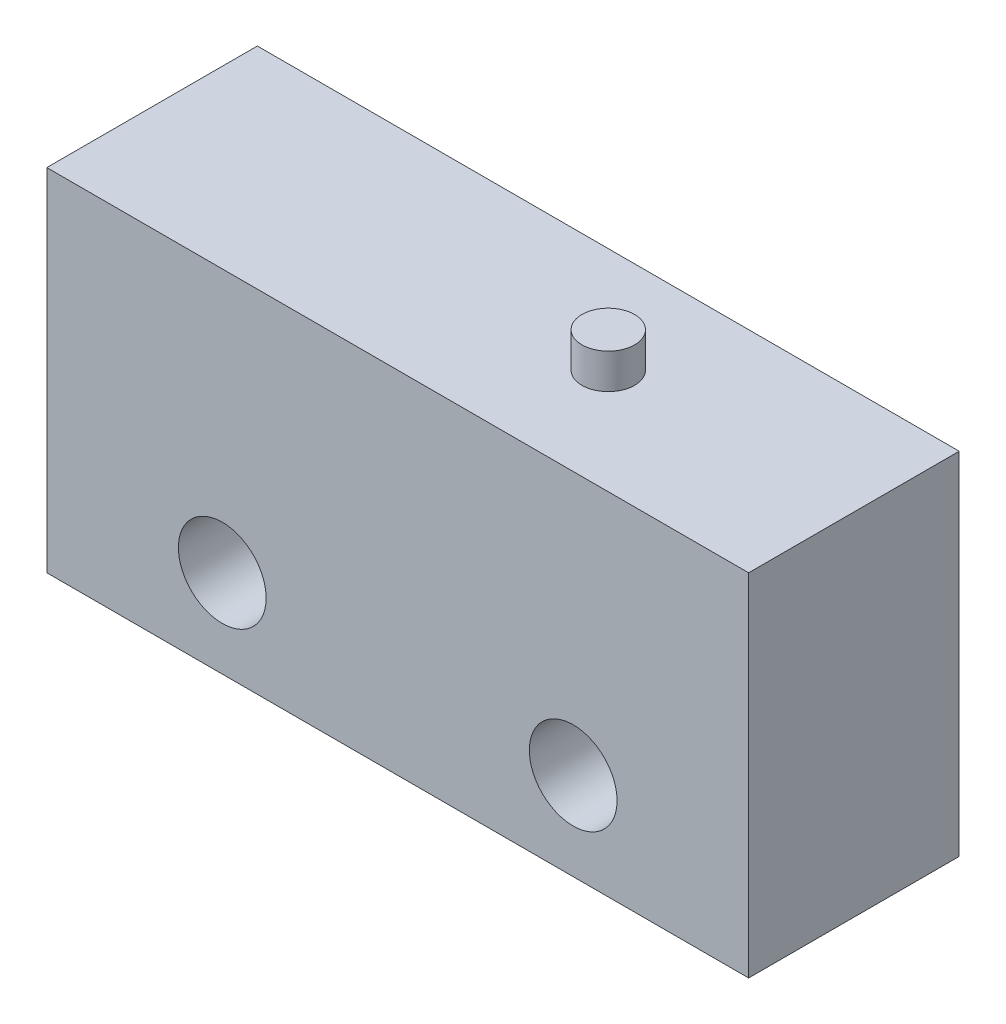
ISO-10303-21;
HEADER;
FILE_DESCRIPTION(('STEP AP214'),'2;1');
FILE_NAME('part.step','',(''),(''),'','','');
FILE_SCHEMA(('AUTOMOTIVE_DESIGN { 1 0 10303 214 1 1 1 1 }'));
ENDSEC;
DATA;
#1=APPLICATION_CONTEXT('core data for automotive mechanical design processes');
#2=APPLICATION_PROTOCOL_DEFINITION('international standard','automotive_design',2000,#1);
#3=PRODUCT_CONTEXT('',#1,'mechanical');
#4=PRODUCT('Part','Part','',(#3));
#5=PRODUCT_RELATED_PRODUCT_CATEGORY('part','',(#4));
#6=PRODUCT_DEFINITION_FORMATION('','',#4);
#7=PRODUCT_DEFINITION_CONTEXT('part definition',#1,'design');
#8=PRODUCT_DEFINITION('design','',#6,#7);
#9=PRODUCT_DEFINITION_SHAPE('','',#8);
#10=(LENGTH_UNIT() NAMED_UNIT(*) SI_UNIT(.MILLI.,.METRE.));
#11=(NAMED_UNIT(*) PLANE_ANGLE_UNIT() SI_UNIT($,.RADIAN.));
#12=(NAMED_UNIT(*) SI_UNIT($,.STERADIAN.) SOLID_ANGLE_UNIT());
#13=UNCERTAINTY_MEASURE_WITH_UNIT(LENGTH_MEASURE(1.E-05),#10,'distance_accuracy_value','');
#14=(GEOMETRIC_REPRESENTATION_CONTEXT(3) GLOBAL_UNCERTAINTY_ASSIGNED_CONTEXT((#13)) GLOBAL_UNIT_ASSIGNED_CONTEXT((#10,
#11,#12)) REPRESENTATION_CONTEXT('',''));
#15=CARTESIAN_POINT('',(0.,0.,0.));
#16=DIRECTION('',(0.,0.,1.));
#17=DIRECTION('',(1.,0.,0.));
#18=AXIS2_PLACEMENT_3D('',#15,#16,#17);
#19=CARTESIAN_POINT('',(10.,4.99999999999999,6.));
#20=DIRECTION('',(0.,-1.,0.));
#21=DIRECTION('',(0.,0.,-1.));
#22=AXIS2_PLACEMENT_3D('',#19,#20,#21);
#23=PLANE('',#22);
#24=DIRECTION('',(-1.,0.,0.));
#25=VECTOR('',#24,1.);
#26=CARTESIAN_POINT('',(10.,4.99999999999999,0.));
#27=LINE('',#26,#25);
#28=CARTESIAN_POINT('',(10.,4.99999999999999,0.));
#29=VERTEX_POINT('',#28);
#30=CARTESIAN_POINT('',(-9.99999999999998,4.99999999999999,0.));
#31=VERTEX_POINT('',#30);
#32=EDGE_CURVE('E139',#29,#31,#27,.T.);
#33=ORIENTED_EDGE('',*,*,#32,.T.);
#34=DIRECTION('',(0.,0.,-1.));
#35=VECTOR('',#34,1.);
#36=CARTESIAN_POINT('',(-9.99999999999998,4.99999999999999,6.));
#37=LINE('',#36,#35);
#38=CARTESIAN_POINT('',(-9.99999999999998,4.99999999999999,6.));
#39=VERTEX_POINT('',#38);
#40=EDGE_CURVE('E136',#39,#31,#37,.T.);
#41=ORIENTED_EDGE('',*,*,#40,.F.);
#42=DIRECTION('',(-1.,0.,0.));
#43=VECTOR('',#42,1.);
#44=CARTESIAN_POINT('',(10.,4.99999999999999,6.));
#45=LINE('',#44,#43);
#46=CARTESIAN_POINT('',(10.,4.99999999999999,6.));
#47=VERTEX_POINT('',#46);
#48=EDGE_CURVE('E125',#47,#39,#45,.T.);
#49=ORIENTED_EDGE('',*,*,#48,.F.);
#50=DIRECTION('',(0.,0.,-1.));
#51=VECTOR('',#50,1.);
#52=CARTESIAN_POINT('',(10.,4.99999999999999,6.));
#53=LINE('',#52,#51);
#54=EDGE_CURVE('E142',#47,#29,#53,.T.);
#55=ORIENTED_EDGE('',*,*,#54,.T.);
#56=EDGE_LOOP('',(#33,#41,#49,#55));
#57=FACE_BOUND('',#56,.T.);
#58=CARTESIAN_POINT('',(3.00000000000002,4.99999999999999,3.));
#59=DIRECTION('',(0.,-1.,0.));
#60=DIRECTION('',(0.,0.,-1.));
#61=AXIS2_PLACEMENT_3D('',#58,#59,#60);
#62=CIRCLE('',#61,0.75);
#63=CARTESIAN_POINT('',(3.00000000000002,4.99999999999999,2.25));
#64=VERTEX_POINT('',#63);
#65=EDGE_CURVE('E12',#64,#64,#62,.F.);
#66=ORIENTED_EDGE('',*,*,#65,.F.);
#67=EDGE_LOOP('',(#66));
#68=FACE_BOUND('',#67,.T.);
#69=ADVANCED_FACE('F70',(#57,#68),#23,.F.);
#70=CARTESIAN_POINT('',(0.,0.,6.));
#71=DIRECTION('',(0.,0.,-1.));
#72=DIRECTION('',(-1.,0.,0.));
#73=AXIS2_PLACEMENT_3D('',#70,#71,#72);
#74=PLANE('',#73);
#75=CARTESIAN_POINT('',(-4.99999999999998,-2.50000000000001,6.));
#76=DIRECTION('',(0.,0.,1.));
#77=DIRECTION('',(1.,0.,0.));
#78=AXIS2_PLACEMENT_3D('',#75,#76,#77);
#79=CIRCLE('',#78,1.25);
#80=CARTESIAN_POINT('',(-3.74999999999998,-2.50000000000001,6.));
#81=VERTEX_POINT('',#80);
#82=EDGE_CURVE('E160',#81,#81,#79,.T.);
#83=ORIENTED_EDGE('',*,*,#82,.F.);
#84=EDGE_LOOP('',(#83));
#85=FACE_BOUND('',#84,.T.);
#86=DIRECTION('',(-1.,0.,0.));
#87=VECTOR('',#86,1.);
#88=CARTESIAN_POINT('',(10.,-5.00000000000002,6.));
#89=LINE('',#88,#87);
#90=CARTESIAN_POINT('',(10.,-5.00000000000002,6.));
#91=VERTEX_POINT('',#90);
#92=CARTESIAN_POINT('',(-9.99999999999998,-5.00000000000001,6.));
#93=VERTEX_POINT('',#92);
#94=EDGE_CURVE('E146',#91,#93,#89,.T.);
#95=ORIENTED_EDGE('',*,*,#94,.F.);
#96=DIRECTION('',(0.,1.,0.));
#97=VECTOR('',#96,1.);
#98=CARTESIAN_POINT('',(10.,-5.00000000000002,6.));
#99=LINE('',#98,#97);
#100=EDGE_CURVE('E131',#91,#47,#99,.T.);
#101=ORIENTED_EDGE('',*,*,#100,.T.);
#102=ORIENTED_EDGE('',*,*,#48,.T.);
#103=DIRECTION('',(0.,1.,0.));
#104=VECTOR('',#103,1.);
#105=CARTESIAN_POINT('',(-9.99999999999998,-5.00000000000001,6.));
#106=LINE('',#105,#104);
#107=EDGE_CURVE('E130',#93,#39,#106,.T.);
#108=ORIENTED_EDGE('',*,*,#107,.F.);
#109=EDGE_LOOP('',(#95,#101,#102,#108));
#110=FACE_BOUND('',#109,.T.);
#111=CARTESIAN_POINT('',(5.00000000000002,-2.50000000000001,6.));
#112=DIRECTION('',(0.,0.,1.));
#113=DIRECTION('',(1.,0.,0.));
#114=AXIS2_PLACEMENT_3D('',#111,#112,#113);
#115=CIRCLE('',#114,1.25);
#116=CARTESIAN_POINT('',(6.25000000000002,-2.50000000000001,6.));
#117=VERTEX_POINT('',#116);
#118=EDGE_CURVE('E182',#117,#117,#115,.T.);
#119=ORIENTED_EDGE('',*,*,#118,.F.);
#120=EDGE_LOOP('',(#119));
#121=FACE_BOUND('',#120,.T.);
#122=ADVANCED_FACE('F128',(#85,#110,#121),#74,.F.);
#123=CARTESIAN_POINT('',(0.,0.,0.));
#124=DIRECTION('',(0.,0.,-1.));
#125=DIRECTION('',(-1.,0.,0.));
#126=AXIS2_PLACEMENT_3D('',#123,#124,#125);
#127=PLANE('',#126);
#128=CARTESIAN_POINT('',(-4.99999999999998,-2.50000000000001,0.));
#129=DIRECTION('',(0.,0.,1.));
#130=DIRECTION('',(1.,0.,0.));
#131=AXIS2_PLACEMENT_3D('',#128,#129,#130);
#132=CIRCLE('',#131,1.25);
#133=CARTESIAN_POINT('',(-3.74999999999998,-2.50000000000001,0.));
#134=VERTEX_POINT('',#133);
#135=EDGE_CURVE('E188',#134,#134,#132,.T.);
#136=ORIENTED_EDGE('',*,*,#135,.T.);
#137=EDGE_LOOP('',(#136));
#138=FACE_BOUND('',#137,.T.);
#139=DIRECTION('',(-1.,0.,0.));
#140=VECTOR('',#139,1.);
#141=CARTESIAN_POINT('',(10.,-5.00000000000002,0.));
#142=LINE('',#141,#140);
#143=CARTESIAN_POINT('',(10.,-5.00000000000002,0.));
#144=VERTEX_POINT('',#143);
#145=CARTESIAN_POINT('',(-9.99999999999998,-5.00000000000001,0.));
#146=VERTEX_POINT('',#145);
#147=EDGE_CURVE('E155',#144,#146,#142,.T.);
#148=ORIENTED_EDGE('',*,*,#147,.T.);
#149=DIRECTION('',(0.,1.,0.));
#150=VECTOR('',#149,1.);
#151=CARTESIAN_POINT('',(-9.99999999999998,-5.00000000000001,0.));
#152=LINE('',#151,#150);
#153=EDGE_CURVE('E159',#146,#31,#152,.T.);
#154=ORIENTED_EDGE('',*,*,#153,.T.);
#155=ORIENTED_EDGE('',*,*,#32,.F.);
#156=DIRECTION('',(0.,1.,0.));
#157=VECTOR('',#156,1.);
#158=CARTESIAN_POINT('',(10.,-5.00000000000002,0.));
#159=LINE('',#158,#157);
#160=EDGE_CURVE('E111',#144,#29,#159,.T.);
#161=ORIENTED_EDGE('',*,*,#160,.F.);
#162=EDGE_LOOP('',(#148,#154,#155,#161));
#163=FACE_BOUND('',#162,.T.);
#164=CARTESIAN_POINT('',(5.00000000000002,-2.50000000000001,0.));
#165=DIRECTION('',(0.,0.,1.));
#166=DIRECTION('',(1.,0.,0.));
#167=AXIS2_PLACEMENT_3D('',#164,#165,#166);
#168=CIRCLE('',#167,1.25);
#169=CARTESIAN_POINT('',(6.25000000000002,-2.50000000000001,0.));
#170=VERTEX_POINT('',#169);
#171=EDGE_CURVE('E179',#170,#170,#168,.T.);
#172=ORIENTED_EDGE('',*,*,#171,.T.);
#173=EDGE_LOOP('',(#172));
#174=FACE_BOUND('',#173,.T.);
#175=ADVANCED_FACE('F172',(#138,#163,#174),#127,.T.);
#176=CARTESIAN_POINT('',(10.,-5.00000000000002,6.));
#177=DIRECTION('',(0.,-1.,0.));
#178=DIRECTION('',(1.,0.,0.));
#179=AXIS2_PLACEMENT_3D('',#176,#177,#178);
#180=PLANE('',#179);
#181=ORIENTED_EDGE('',*,*,#147,.F.);
#182=DIRECTION('',(0.,0.,-1.));
#183=VECTOR('',#182,1.);
#184=CARTESIAN_POINT('',(10.,-5.00000000000002,6.));
#185=LINE('',#184,#183);
#186=EDGE_CURVE('E80',#91,#144,#185,.T.);
#187=ORIENTED_EDGE('',*,*,#186,.F.);
#188=ORIENTED_EDGE('',*,*,#94,.T.);
#189=DIRECTION('',(0.,0.,-1.));
#190=VECTOR('',#189,1.);
#191=CARTESIAN_POINT('',(-9.99999999999998,-5.00000000000001,6.));
#192=LINE('',#191,#190);
#193=EDGE_CURVE('E120',#93,#146,#192,.T.);
#194=ORIENTED_EDGE('',*,*,#193,.T.);
#195=EDGE_LOOP('',(#181,#187,#188,#194));
#196=FACE_BOUND('',#195,.T.);
#197=ADVANCED_FACE('F72',(#196),#180,.T.);
#198=CARTESIAN_POINT('',(10.,-5.00000000000002,6.));
#199=DIRECTION('',(-1.,0.,0.));
#200=DIRECTION('',(0.,0.,1.));
#201=AXIS2_PLACEMENT_3D('',#198,#199,#200);
#202=PLANE('',#201);
#203=ORIENTED_EDGE('',*,*,#160,.T.);
#204=ORIENTED_EDGE('',*,*,#54,.F.);
#205=ORIENTED_EDGE('',*,*,#100,.F.);
#206=ORIENTED_EDGE('',*,*,#186,.T.);
#207=EDGE_LOOP('',(#203,#204,#205,#206));
#208=FACE_BOUND('',#207,.T.);
#209=ADVANCED_FACE('F210',(#208),#202,.F.);
#210=CARTESIAN_POINT('',(-9.99999999999998,-5.00000000000001,6.));
#211=DIRECTION('',(-1.,0.,0.));
#212=DIRECTION('',(0.,0.,1.));
#213=AXIS2_PLACEMENT_3D('',#210,#211,#212);
#214=PLANE('',#213);
#215=ORIENTED_EDGE('',*,*,#153,.F.);
#216=ORIENTED_EDGE('',*,*,#193,.F.);
#217=ORIENTED_EDGE('',*,*,#107,.T.);
#218=ORIENTED_EDGE('',*,*,#40,.T.);
#219=EDGE_LOOP('',(#215,#216,#217,#218));
#220=FACE_BOUND('',#219,.T.);
#221=ADVANCED_FACE('F144',(#220),#214,.T.);
#222=CARTESIAN_POINT('',(-4.99999999999998,-2.50000000000001,6.));
#223=DIRECTION('',(0.,0.,-1.));
#224=DIRECTION('',(-1.,0.,0.));
#225=AXIS2_PLACEMENT_3D('',#222,#223,#224);
#226=CYLINDRICAL_SURFACE('',#225,1.25);
#227=ORIENTED_EDGE('',*,*,#82,.T.);
#228=EDGE_LOOP('',(#227));
#229=FACE_BOUND('',#228,.T.);
#230=ORIENTED_EDGE('',*,*,#135,.F.);
#231=EDGE_LOOP('',(#230));
#232=FACE_BOUND('',#231,.T.);
#233=ADVANCED_FACE('F198',(#229,#232),#226,.F.);
#234=CARTESIAN_POINT('',(5.00000000000002,-2.50000000000001,6.));
#235=DIRECTION('',(0.,0.,-1.));
#236=DIRECTION('',(-1.,0.,0.));
#237=AXIS2_PLACEMENT_3D('',#234,#235,#236);
#238=CYLINDRICAL_SURFACE('',#237,1.25);
#239=ORIENTED_EDGE('',*,*,#118,.T.);
#240=EDGE_LOOP('',(#239));
#241=FACE_BOUND('',#240,.T.);
#242=ORIENTED_EDGE('',*,*,#171,.F.);
#243=EDGE_LOOP('',(#242));
#244=FACE_BOUND('',#243,.T.);
#245=ADVANCED_FACE('F200',(#241,#244),#238,.F.);
#246=CARTESIAN_POINT('',(3.00000000000002,5.99999999999999,3.));
#247=DIRECTION('',(0.,-1.,0.));
#248=DIRECTION('',(0.,0.,-1.));
#249=AXIS2_PLACEMENT_3D('',#246,#247,#248);
#250=CYLINDRICAL_SURFACE('',#249,0.75);
#251=CARTESIAN_POINT('',(3.00000000000002,5.99999999999999,3.));
#252=DIRECTION('',(0.,1.,0.));
#253=DIRECTION('',(0.,0.,1.));
#254=AXIS2_PLACEMENT_3D('',#251,#252,#253);
#255=CIRCLE('',#254,0.75);
#256=CARTESIAN_POINT('',(3.00000000000002,5.99999999999999,3.75));
#257=VERTEX_POINT('',#256);
#258=EDGE_CURVE('E183',#257,#257,#255,.T.);
#259=ORIENTED_EDGE('',*,*,#258,.F.);
#260=EDGE_LOOP('',(#259));
#261=FACE_BOUND('',#260,.T.);
#262=ORIENTED_EDGE('',*,*,#65,.T.);
#263=EDGE_LOOP('',(#262));
#264=FACE_BOUND('',#263,.T.);
#265=ADVANCED_FACE('F207',(#261,#264),#250,.T.);
#266=CARTESIAN_POINT('',(3.00000000000002,5.99999999999999,3.));
#267=DIRECTION('',(0.,1.,0.));
#268=DIRECTION('',(0.,0.,1.));
#269=AXIS2_PLACEMENT_3D('',#266,#267,#268);
#270=PLANE('',#269);
#271=ORIENTED_EDGE('',*,*,#258,.T.);
#272=EDGE_LOOP('',(#271));
#273=FACE_BOUND('',#272,.T.);
#274=ADVANCED_FACE('F276',(#273),#270,.T.);
#275=CLOSED_SHELL('',(#69,#122,#175,#197,#209,#221,#233,#245,#265,#274));
#276=MANIFOLD_SOLID_BREP('B2',#275);
#277=ADVANCED_BREP_SHAPE_REPRESENTATION('',(#18,#276),#14);
#278=SHAPE_DEFINITION_REPRESENTATION(#9,#277);
ENDSEC;
END-ISO-10303-21;
